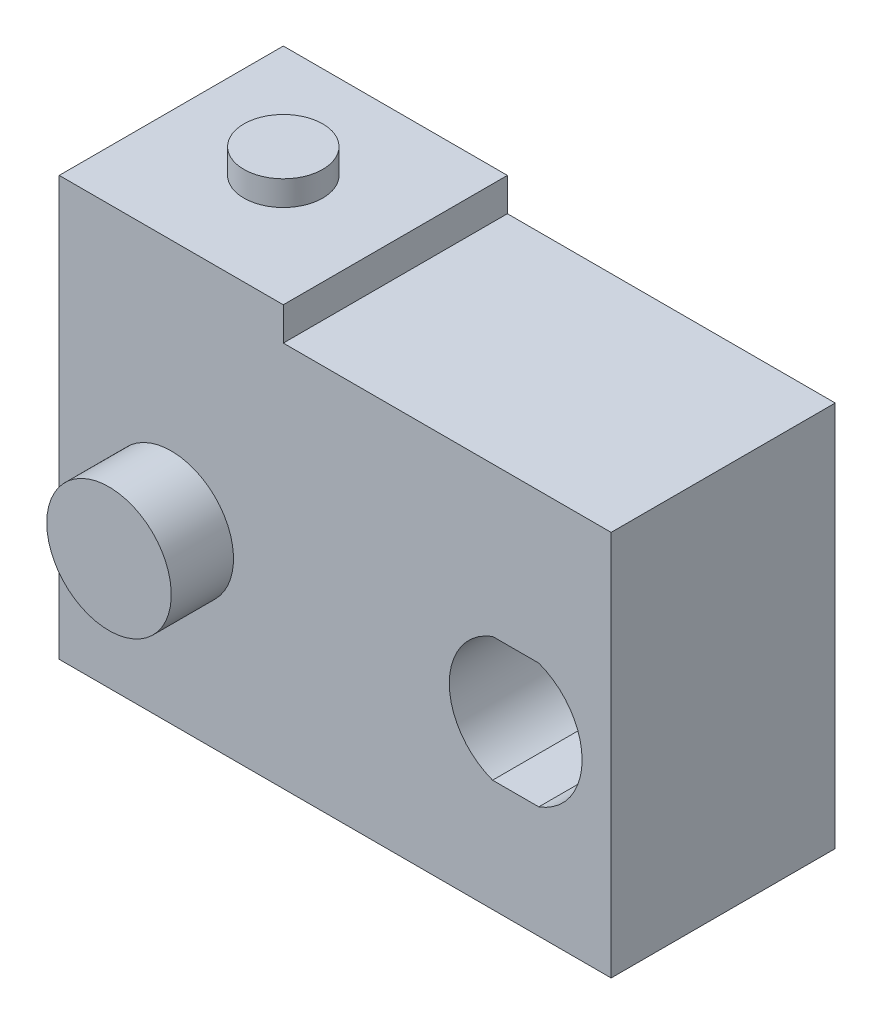
ISO-10303-21;
HEADER;
FILE_DESCRIPTION(('STEP AP214'),'2;1');
FILE_NAME('part.step','',(''),(''),'','','');
FILE_SCHEMA(('AUTOMOTIVE_DESIGN { 1 0 10303 214 1 1 1 1 }'));
ENDSEC;
DATA;
#1=APPLICATION_CONTEXT('core data for automotive mechanical design processes');
#2=APPLICATION_PROTOCOL_DEFINITION('international standard','automotive_design',2000,#1);
#3=PRODUCT_CONTEXT('',#1,'mechanical');
#4=PRODUCT('Part','Part','',(#3));
#5=PRODUCT_RELATED_PRODUCT_CATEGORY('part','',(#4));
#6=PRODUCT_DEFINITION_FORMATION('','',#4);
#7=PRODUCT_DEFINITION_CONTEXT('part definition',#1,'design');
#8=PRODUCT_DEFINITION('design','',#6,#7);
#9=PRODUCT_DEFINITION_SHAPE('','',#8);
#10=(LENGTH_UNIT() NAMED_UNIT(*) SI_UNIT(.MILLI.,.METRE.));
#11=(NAMED_UNIT(*) PLANE_ANGLE_UNIT() SI_UNIT($,.RADIAN.));
#12=(NAMED_UNIT(*) SI_UNIT($,.STERADIAN.) SOLID_ANGLE_UNIT());
#13=UNCERTAINTY_MEASURE_WITH_UNIT(LENGTH_MEASURE(1.E-05),#10,'distance_accuracy_value','');
#14=(GEOMETRIC_REPRESENTATION_CONTEXT(3) GLOBAL_UNCERTAINTY_ASSIGNED_CONTEXT((#13)) GLOBAL_UNIT_ASSIGNED_CONTEXT((#10,
#11,#12)) REPRESENTATION_CONTEXT('',''));
#15=CARTESIAN_POINT('',(0.,0.,0.));
#16=DIRECTION('',(0.,0.,1.));
#17=DIRECTION('',(1.,0.,0.));
#18=AXIS2_PLACEMENT_3D('',#15,#16,#17);
#19=CARTESIAN_POINT('',(0.,0.,2.7));
#20=DIRECTION('',(0.,0.,-1.));
#21=DIRECTION('',(-1.,0.,0.));
#22=AXIS2_PLACEMENT_3D('',#19,#20,#21);
#23=PLANE('',#22);
#24=CARTESIAN_POINT('',(-3.95,-0.449999999999998,2.7));
#25=DIRECTION('',(0.,0.,-1.));
#26=DIRECTION('',(-1.,0.,0.));
#27=AXIS2_PLACEMENT_3D('',#24,#25,#26);
#28=CIRCLE('',#27,1.5);
#29=CARTESIAN_POINT('',(-5.45,-0.449999999999998,2.7));
#30=VERTEX_POINT('',#29);
#31=EDGE_CURVE('E49',#30,#30,#28,.F.);
#32=ORIENTED_EDGE('',*,*,#31,.F.);
#33=EDGE_LOOP('',(#32));
#34=FACE_BOUND('',#33,.T.);
#35=DIRECTION('',(0.,-1.,0.));
#36=VECTOR('',#35,1.);
#37=CARTESIAN_POINT('',(-6.65,4.65,2.7));
#38=LINE('',#37,#36);
#39=CARTESIAN_POINT('',(-6.65,5.45,2.7));
#40=VERTEX_POINT('',#39);
#41=CARTESIAN_POINT('',(-6.65,-4.65,2.7));
#42=VERTEX_POINT('',#41);
#43=EDGE_CURVE('E156',#40,#42,#38,.T.);
#44=ORIENTED_EDGE('',*,*,#43,.T.);
#45=DIRECTION('',(1.,0.,0.));
#46=VECTOR('',#45,1.);
#47=CARTESIAN_POINT('',(6.65,-4.65,2.7));
#48=LINE('',#47,#46);
#49=CARTESIAN_POINT('',(6.65,-4.65,2.7));
#50=VERTEX_POINT('',#49);
#51=EDGE_CURVE('E158',#42,#50,#48,.T.);
#52=ORIENTED_EDGE('',*,*,#51,.T.);
#53=DIRECTION('',(0.,1.,0.));
#54=VECTOR('',#53,1.);
#55=CARTESIAN_POINT('',(6.65,-4.65,2.7));
#56=LINE('',#55,#54);
#57=CARTESIAN_POINT('',(6.65,4.65,2.7));
#58=VERTEX_POINT('',#57);
#59=EDGE_CURVE('E161',#50,#58,#56,.T.);
#60=ORIENTED_EDGE('',*,*,#59,.T.);
#61=DIRECTION('',(-1.,0.,0.));
#62=VECTOR('',#61,1.);
#63=CARTESIAN_POINT('',(6.65,4.65,2.7));
#64=LINE('',#63,#62);
#65=CARTESIAN_POINT('',(-1.25,4.65,2.7));
#66=VERTEX_POINT('',#65);
#67=EDGE_CURVE('E163',#58,#66,#64,.T.);
#68=ORIENTED_EDGE('',*,*,#67,.T.);
#69=DIRECTION('',(0.,1.,0.));
#70=VECTOR('',#69,1.);
#71=CARTESIAN_POINT('',(-1.25,5.45,2.7));
#72=LINE('',#71,#70);
#73=CARTESIAN_POINT('',(-1.25,5.45,2.7));
#74=VERTEX_POINT('',#73);
#75=EDGE_CURVE('E165',#66,#74,#72,.T.);
#76=ORIENTED_EDGE('',*,*,#75,.T.);
#77=DIRECTION('',(-1.,0.,0.));
#78=VECTOR('',#77,1.);
#79=CARTESIAN_POINT('',(-6.65,5.45,2.7));
#80=LINE('',#79,#78);
#81=EDGE_CURVE('E167',#74,#40,#80,.T.);
#82=ORIENTED_EDGE('',*,*,#81,.T.);
#83=EDGE_LOOP('',(#44,#52,#60,#68,#76,#82));
#84=FACE_BOUND('',#83,.T.);
#85=CARTESIAN_POINT('',(4.35,-0.449999999999998,2.7));
#86=DIRECTION('',(0.,0.,1.));
#87=DIRECTION('',(1.,0.,0.));
#88=AXIS2_PLACEMENT_3D('',#85,#86,#87);
#89=CIRCLE('',#88,1.6);
#90=CARTESIAN_POINT('',(3.79322356371699,1.05,2.7));
#91=VERTEX_POINT('',#90);
#92=CARTESIAN_POINT('',(3.79322356371699,-1.95,2.7));
#93=VERTEX_POINT('',#92);
#94=EDGE_CURVE('E119',#91,#93,#89,.T.);
#95=ORIENTED_EDGE('',*,*,#94,.F.);
#96=DIRECTION('',(-1.,0.,0.));
#97=VECTOR('',#96,1.);
#98=CARTESIAN_POINT('',(3.79322356371699,1.05,2.7));
#99=LINE('',#98,#97);
#100=CARTESIAN_POINT('',(4.906776436283,1.05,2.7));
#101=VERTEX_POINT('',#100);
#102=EDGE_CURVE('E141',#101,#91,#99,.T.);
#103=ORIENTED_EDGE('',*,*,#102,.F.);
#104=CARTESIAN_POINT('',(4.35,-0.449999999999998,2.7));
#105=DIRECTION('',(0.,0.,1.));
#106=DIRECTION('',(1.,0.,0.));
#107=AXIS2_PLACEMENT_3D('',#104,#105,#106);
#108=CIRCLE('',#107,1.6);
#109=CARTESIAN_POINT('',(4.906776436283,-1.95,2.7));
#110=VERTEX_POINT('',#109);
#111=EDGE_CURVE('E139',#110,#101,#108,.T.);
#112=ORIENTED_EDGE('',*,*,#111,.F.);
#113=DIRECTION('',(1.,0.,0.));
#114=VECTOR('',#113,1.);
#115=CARTESIAN_POINT('',(4.906776436283,-1.95,2.7));
#116=LINE('',#115,#114);
#117=EDGE_CURVE('E127',#93,#110,#116,.T.);
#118=ORIENTED_EDGE('',*,*,#117,.F.);
#119=EDGE_LOOP('',(#95,#103,#112,#118));
#120=FACE_BOUND('',#119,.T.);
#121=ADVANCED_FACE('F40',(#34,#84,#120),#23,.F.);
#122=CARTESIAN_POINT('',(0.,0.,-2.7));
#123=DIRECTION('',(0.,0.,-1.));
#124=DIRECTION('',(-1.,0.,0.));
#125=AXIS2_PLACEMENT_3D('',#122,#123,#124);
#126=PLANE('',#125);
#127=CARTESIAN_POINT('',(-3.95,-0.449999999999998,-2.7));
#128=DIRECTION('',(0.,0.,-1.));
#129=DIRECTION('',(-1.,0.,0.));
#130=AXIS2_PLACEMENT_3D('',#127,#128,#129);
#131=CIRCLE('',#130,1.5);
#132=CARTESIAN_POINT('',(-5.45,-0.449999999999998,-2.7));
#133=VERTEX_POINT('',#132);
#134=EDGE_CURVE('E44',#133,#133,#131,.F.);
#135=ORIENTED_EDGE('',*,*,#134,.T.);
#136=EDGE_LOOP('',(#135));
#137=FACE_BOUND('',#136,.T.);
#138=DIRECTION('',(0.,-1.,0.));
#139=VECTOR('',#138,1.);
#140=CARTESIAN_POINT('',(-6.65,-4.65,-2.7));
#141=LINE('',#140,#139);
#142=CARTESIAN_POINT('',(-6.65,5.45,-2.7));
#143=VERTEX_POINT('',#142);
#144=CARTESIAN_POINT('',(-6.65,-4.65,-2.7));
#145=VERTEX_POINT('',#144);
#146=EDGE_CURVE('E135',#143,#145,#141,.T.);
#147=ORIENTED_EDGE('',*,*,#146,.F.);
#148=DIRECTION('',(-1.,0.,0.));
#149=VECTOR('',#148,1.);
#150=CARTESIAN_POINT('',(-6.65,5.45,-2.7));
#151=LINE('',#150,#149);
#152=CARTESIAN_POINT('',(-1.25,5.45,-2.7));
#153=VERTEX_POINT('',#152);
#154=EDGE_CURVE('E159',#153,#143,#151,.T.);
#155=ORIENTED_EDGE('',*,*,#154,.F.);
#156=DIRECTION('',(0.,1.,0.));
#157=VECTOR('',#156,1.);
#158=CARTESIAN_POINT('',(-1.25,5.45,-2.7));
#159=LINE('',#158,#157);
#160=CARTESIAN_POINT('',(-1.25,4.65,-2.7));
#161=VERTEX_POINT('',#160);
#162=EDGE_CURVE('E177',#161,#153,#159,.T.);
#163=ORIENTED_EDGE('',*,*,#162,.F.);
#164=DIRECTION('',(-1.,0.,0.));
#165=VECTOR('',#164,1.);
#166=CARTESIAN_POINT('',(6.65,4.65,-2.7));
#167=LINE('',#166,#165);
#168=CARTESIAN_POINT('',(6.65,4.65,-2.7));
#169=VERTEX_POINT('',#168);
#170=EDGE_CURVE('E175',#169,#161,#167,.T.);
#171=ORIENTED_EDGE('',*,*,#170,.F.);
#172=DIRECTION('',(0.,1.,0.));
#173=VECTOR('',#172,1.);
#174=CARTESIAN_POINT('',(6.65,-4.65,-2.7));
#175=LINE('',#174,#173);
#176=CARTESIAN_POINT('',(6.65,-4.65,-2.7));
#177=VERTEX_POINT('',#176);
#178=EDGE_CURVE('E173',#177,#169,#175,.T.);
#179=ORIENTED_EDGE('',*,*,#178,.F.);
#180=DIRECTION('',(1.,0.,0.));
#181=VECTOR('',#180,1.);
#182=CARTESIAN_POINT('',(6.65,-4.65,-2.7));
#183=LINE('',#182,#181);
#184=EDGE_CURVE('E171',#145,#177,#183,.T.);
#185=ORIENTED_EDGE('',*,*,#184,.F.);
#186=EDGE_LOOP('',(#147,#155,#163,#171,#179,#185));
#187=FACE_BOUND('',#186,.T.);
#188=DIRECTION('',(-1.,0.,0.));
#189=VECTOR('',#188,1.);
#190=CARTESIAN_POINT('',(3.79322356371699,1.05,-2.7));
#191=LINE('',#190,#189);
#192=CARTESIAN_POINT('',(4.906776436283,1.05,-2.7));
#193=VERTEX_POINT('',#192);
#194=CARTESIAN_POINT('',(3.79322356371699,1.05,-2.7));
#195=VERTEX_POINT('',#194);
#196=EDGE_CURVE('E128',#193,#195,#191,.T.);
#197=ORIENTED_EDGE('',*,*,#196,.T.);
#198=CARTESIAN_POINT('',(4.35,-0.449999999999998,-2.7));
#199=DIRECTION('',(0.,0.,1.));
#200=DIRECTION('',(1.,0.,0.));
#201=AXIS2_PLACEMENT_3D('',#198,#199,#200);
#202=CIRCLE('',#201,1.6);
#203=CARTESIAN_POINT('',(3.79322356371699,-1.95,-2.7));
#204=VERTEX_POINT('',#203);
#205=EDGE_CURVE('E65',#195,#204,#202,.T.);
#206=ORIENTED_EDGE('',*,*,#205,.T.);
#207=DIRECTION('',(1.,0.,0.));
#208=VECTOR('',#207,1.);
#209=CARTESIAN_POINT('',(4.906776436283,-1.95,-2.7));
#210=LINE('',#209,#208);
#211=CARTESIAN_POINT('',(4.906776436283,-1.95,-2.7));
#212=VERTEX_POINT('',#211);
#213=EDGE_CURVE('E134',#204,#212,#210,.T.);
#214=ORIENTED_EDGE('',*,*,#213,.T.);
#215=CARTESIAN_POINT('',(4.35,-0.449999999999998,-2.7));
#216=DIRECTION('',(0.,0.,1.));
#217=DIRECTION('',(1.,0.,0.));
#218=AXIS2_PLACEMENT_3D('',#215,#216,#217);
#219=CIRCLE('',#218,1.6);
#220=EDGE_CURVE('E148',#212,#193,#219,.T.);
#221=ORIENTED_EDGE('',*,*,#220,.T.);
#222=EDGE_LOOP('',(#197,#206,#214,#221));
#223=FACE_BOUND('',#222,.T.);
#224=ADVANCED_FACE('F230',(#137,#187,#223),#126,.T.);
#225=CARTESIAN_POINT('',(-6.65,-4.65,2.7));
#226=DIRECTION('',(1.,0.,0.));
#227=DIRECTION('',(0.,0.,-1.));
#228=AXIS2_PLACEMENT_3D('',#225,#226,#227);
#229=PLANE('',#228);
#230=ORIENTED_EDGE('',*,*,#146,.T.);
#231=DIRECTION('',(0.,0.,-1.));
#232=VECTOR('',#231,1.);
#233=CARTESIAN_POINT('',(-6.65,-4.65,2.7));
#234=LINE('',#233,#232);
#235=EDGE_CURVE('E194',#42,#145,#234,.T.);
#236=ORIENTED_EDGE('',*,*,#235,.F.);
#237=ORIENTED_EDGE('',*,*,#43,.F.);
#238=DIRECTION('',(0.,0.,-1.));
#239=VECTOR('',#238,1.);
#240=CARTESIAN_POINT('',(-6.65,5.45,2.7));
#241=LINE('',#240,#239);
#242=EDGE_CURVE('E169',#40,#143,#241,.T.);
#243=ORIENTED_EDGE('',*,*,#242,.T.);
#244=EDGE_LOOP('',(#230,#236,#237,#243));
#245=FACE_BOUND('',#244,.T.);
#246=ADVANCED_FACE('F42',(#245),#229,.F.);
#247=CARTESIAN_POINT('',(6.65,-4.65,2.7));
#248=DIRECTION('',(0.,1.,0.));
#249=DIRECTION('',(-1.,0.,0.));
#250=AXIS2_PLACEMENT_3D('',#247,#248,#249);
#251=PLANE('',#250);
#252=ORIENTED_EDGE('',*,*,#184,.T.);
#253=DIRECTION('',(0.,0.,-1.));
#254=VECTOR('',#253,1.);
#255=CARTESIAN_POINT('',(6.65,-4.65,2.7));
#256=LINE('',#255,#254);
#257=EDGE_CURVE('E192',#50,#177,#256,.T.);
#258=ORIENTED_EDGE('',*,*,#257,.F.);
#259=ORIENTED_EDGE('',*,*,#51,.F.);
#260=ORIENTED_EDGE('',*,*,#235,.T.);
#261=EDGE_LOOP('',(#252,#258,#259,#260));
#262=FACE_BOUND('',#261,.T.);
#263=ADVANCED_FACE('F256',(#262),#251,.F.);
#264=CARTESIAN_POINT('',(6.65,-4.65,2.7));
#265=DIRECTION('',(-1.,0.,0.));
#266=DIRECTION('',(0.,0.,1.));
#267=AXIS2_PLACEMENT_3D('',#264,#265,#266);
#268=PLANE('',#267);
#269=ORIENTED_EDGE('',*,*,#178,.T.);
#270=DIRECTION('',(0.,0.,-1.));
#271=VECTOR('',#270,1.);
#272=CARTESIAN_POINT('',(6.65,4.65,2.7));
#273=LINE('',#272,#271);
#274=EDGE_CURVE('E189',#58,#169,#273,.T.);
#275=ORIENTED_EDGE('',*,*,#274,.F.);
#276=ORIENTED_EDGE('',*,*,#59,.F.);
#277=ORIENTED_EDGE('',*,*,#257,.T.);
#278=EDGE_LOOP('',(#269,#275,#276,#277));
#279=FACE_BOUND('',#278,.T.);
#280=ADVANCED_FACE('F253',(#279),#268,.F.);
#281=CARTESIAN_POINT('',(6.65,4.65,2.7));
#282=DIRECTION('',(0.,-1.,0.));
#283=DIRECTION('',(1.,0.,0.));
#284=AXIS2_PLACEMENT_3D('',#281,#282,#283);
#285=PLANE('',#284);
#286=ORIENTED_EDGE('',*,*,#170,.T.);
#287=DIRECTION('',(0.,0.,-1.));
#288=VECTOR('',#287,1.);
#289=CARTESIAN_POINT('',(-1.25,4.65,2.7));
#290=LINE('',#289,#288);
#291=EDGE_CURVE('E186',#66,#161,#290,.T.);
#292=ORIENTED_EDGE('',*,*,#291,.F.);
#293=ORIENTED_EDGE('',*,*,#67,.F.);
#294=ORIENTED_EDGE('',*,*,#274,.T.);
#295=EDGE_LOOP('',(#286,#292,#293,#294));
#296=FACE_BOUND('',#295,.T.);
#297=ADVANCED_FACE('F249',(#296),#285,.F.);
#298=CARTESIAN_POINT('',(-1.25,5.45,2.7));
#299=DIRECTION('',(-1.,0.,0.));
#300=DIRECTION('',(0.,0.,1.));
#301=AXIS2_PLACEMENT_3D('',#298,#299,#300);
#302=PLANE('',#301);
#303=ORIENTED_EDGE('',*,*,#162,.T.);
#304=DIRECTION('',(0.,0.,-1.));
#305=VECTOR('',#304,1.);
#306=CARTESIAN_POINT('',(-1.25,5.45,2.7));
#307=LINE('',#306,#305);
#308=EDGE_CURVE('E183',#74,#153,#307,.T.);
#309=ORIENTED_EDGE('',*,*,#308,.F.);
#310=ORIENTED_EDGE('',*,*,#75,.F.);
#311=ORIENTED_EDGE('',*,*,#291,.T.);
#312=EDGE_LOOP('',(#303,#309,#310,#311));
#313=FACE_BOUND('',#312,.T.);
#314=ADVANCED_FACE('F245',(#313),#302,.F.);
#315=CARTESIAN_POINT('',(-6.65,5.45,2.7));
#316=DIRECTION('',(0.,-1.,0.));
#317=DIRECTION('',(0.,0.,-1.));
#318=AXIS2_PLACEMENT_3D('',#315,#316,#317);
#319=PLANE('',#318);
#320=CARTESIAN_POINT('',(-3.95,5.45,0.));
#321=DIRECTION('',(0.,1.,0.));
#322=DIRECTION('',(0.,0.,1.));
#323=AXIS2_PLACEMENT_3D('',#320,#321,#322);
#324=CIRCLE('',#323,0.95);
#325=CARTESIAN_POINT('',(-3.95,5.45,0.95));
#326=VERTEX_POINT('',#325);
#327=EDGE_CURVE('E12',#326,#326,#324,.T.);
#328=ORIENTED_EDGE('',*,*,#327,.F.);
#329=EDGE_LOOP('',(#328));
#330=FACE_BOUND('',#329,.T.);
#331=ORIENTED_EDGE('',*,*,#154,.T.);
#332=ORIENTED_EDGE('',*,*,#242,.F.);
#333=ORIENTED_EDGE('',*,*,#81,.F.);
#334=ORIENTED_EDGE('',*,*,#308,.T.);
#335=EDGE_LOOP('',(#331,#332,#333,#334));
#336=FACE_BOUND('',#335,.T.);
#337=ADVANCED_FACE('F242',(#330,#336),#319,.F.);
#338=CARTESIAN_POINT('',(4.35,-0.449999999999998,2.7));
#339=DIRECTION('',(0.,0.,-1.));
#340=DIRECTION('',(-1.,0.,0.));
#341=AXIS2_PLACEMENT_3D('',#338,#339,#340);
#342=CYLINDRICAL_SURFACE('',#341,1.6);
#343=ORIENTED_EDGE('',*,*,#205,.F.);
#344=DIRECTION('',(0.,0.,-1.));
#345=VECTOR('',#344,1.);
#346=CARTESIAN_POINT('',(3.79322356371699,1.05,2.7));
#347=LINE('',#346,#345);
#348=EDGE_CURVE('E123',#91,#195,#347,.T.);
#349=ORIENTED_EDGE('',*,*,#348,.F.);
#350=ORIENTED_EDGE('',*,*,#94,.T.);
#351=DIRECTION('',(0.,0.,-1.));
#352=VECTOR('',#351,1.);
#353=CARTESIAN_POINT('',(3.79322356371699,-1.95,2.7));
#354=LINE('',#353,#352);
#355=EDGE_CURVE('E122',#93,#204,#354,.T.);
#356=ORIENTED_EDGE('',*,*,#355,.T.);
#357=EDGE_LOOP('',(#343,#349,#350,#356));
#358=FACE_BOUND('',#357,.T.);
#359=ADVANCED_FACE('F121',(#358),#342,.F.);
#360=CARTESIAN_POINT('',(4.906776436283,-1.95,2.7));
#361=DIRECTION('',(0.,1.,0.));
#362=DIRECTION('',(-1.,0.,0.));
#363=AXIS2_PLACEMENT_3D('',#360,#361,#362);
#364=PLANE('',#363);
#365=ORIENTED_EDGE('',*,*,#213,.F.);
#366=ORIENTED_EDGE('',*,*,#355,.F.);
#367=ORIENTED_EDGE('',*,*,#117,.T.);
#368=DIRECTION('',(0.,0.,-1.));
#369=VECTOR('',#368,1.);
#370=CARTESIAN_POINT('',(4.906776436283,-1.95,2.7));
#371=LINE('',#370,#369);
#372=EDGE_CURVE('E136',#110,#212,#371,.T.);
#373=ORIENTED_EDGE('',*,*,#372,.T.);
#374=EDGE_LOOP('',(#365,#366,#367,#373));
#375=FACE_BOUND('',#374,.T.);
#376=ADVANCED_FACE('F131',(#375),#364,.T.);
#377=CARTESIAN_POINT('',(4.35,-0.449999999999998,2.7));
#378=DIRECTION('',(0.,0.,-1.));
#379=DIRECTION('',(-1.,0.,0.));
#380=AXIS2_PLACEMENT_3D('',#377,#378,#379);
#381=CYLINDRICAL_SURFACE('',#380,1.6);
#382=ORIENTED_EDGE('',*,*,#220,.F.);
#383=ORIENTED_EDGE('',*,*,#372,.F.);
#384=ORIENTED_EDGE('',*,*,#111,.T.);
#385=DIRECTION('',(0.,0.,-1.));
#386=VECTOR('',#385,1.);
#387=CARTESIAN_POINT('',(4.906776436283,1.05,2.7));
#388=LINE('',#387,#386);
#389=EDGE_CURVE('E57',#101,#193,#388,.T.);
#390=ORIENTED_EDGE('',*,*,#389,.T.);
#391=EDGE_LOOP('',(#382,#383,#384,#390));
#392=FACE_BOUND('',#391,.T.);
#393=ADVANCED_FACE('F284',(#392),#381,.F.);
#394=CARTESIAN_POINT('',(3.79322356371699,1.05,2.7));
#395=DIRECTION('',(0.,-1.,0.));
#396=DIRECTION('',(1.,0.,0.));
#397=AXIS2_PLACEMENT_3D('',#394,#395,#396);
#398=PLANE('',#397);
#399=ORIENTED_EDGE('',*,*,#196,.F.);
#400=ORIENTED_EDGE('',*,*,#389,.F.);
#401=ORIENTED_EDGE('',*,*,#102,.T.);
#402=ORIENTED_EDGE('',*,*,#348,.T.);
#403=EDGE_LOOP('',(#399,#400,#401,#402));
#404=FACE_BOUND('',#403,.T.);
#405=ADVANCED_FACE('F281',(#404),#398,.T.);
#406=CARTESIAN_POINT('',(0.,0.,-4.2));
#407=DIRECTION('',(0.,0.,-1.));
#408=DIRECTION('',(-1.,0.,0.));
#409=AXIS2_PLACEMENT_3D('',#406,#407,#408);
#410=PLANE('',#409);
#411=CARTESIAN_POINT('',(-3.95,-0.449999999999998,-4.2));
#412=DIRECTION('',(0.,0.,-1.));
#413=DIRECTION('',(-1.,0.,0.));
#414=AXIS2_PLACEMENT_3D('',#411,#412,#413);
#415=CIRCLE('',#414,1.5);
#416=CARTESIAN_POINT('',(-5.45,-0.449999999999998,-4.2));
#417=VERTEX_POINT('',#416);
#418=EDGE_CURVE('E207',#417,#417,#415,.F.);
#419=ORIENTED_EDGE('',*,*,#418,.F.);
#420=EDGE_LOOP('',(#419));
#421=FACE_BOUND('',#420,.T.);
#422=ADVANCED_FACE('F283',(#421),#410,.T.);
#423=CARTESIAN_POINT('',(-3.95,-0.449999999999998,9.94264068711929));
#424=DIRECTION('',(0.,0.,-1.));
#425=DIRECTION('',(-1.,0.,0.));
#426=AXIS2_PLACEMENT_3D('',#423,#424,#425);
#427=CYLINDRICAL_SURFACE('',#426,1.5);
#428=ORIENTED_EDGE('',*,*,#134,.F.);
#429=EDGE_LOOP('',(#428));
#430=FACE_BOUND('',#429,.T.);
#431=ORIENTED_EDGE('',*,*,#418,.T.);
#432=EDGE_LOOP('',(#431));
#433=FACE_BOUND('',#432,.T.);
#434=ADVANCED_FACE('F290',(#430,#433),#427,.T.);
#435=CARTESIAN_POINT('',(-3.95,-0.449999999999998,4.2));
#436=DIRECTION('',(0.,0.,-1.));
#437=DIRECTION('',(-1.,0.,0.));
#438=AXIS2_PLACEMENT_3D('',#435,#436,#437);
#439=CIRCLE('',#438,1.5);
#440=CARTESIAN_POINT('',(-5.45,-0.449999999999998,4.2));
#441=VERTEX_POINT('',#440);
#442=EDGE_CURVE('E204',#441,#441,#439,.T.);
#443=ORIENTED_EDGE('',*,*,#442,.T.);
#444=EDGE_LOOP('',(#443));
#445=FACE_BOUND('',#444,.T.);
#446=ORIENTED_EDGE('',*,*,#31,.T.);
#447=EDGE_LOOP('',(#446));
#448=FACE_BOUND('',#447,.T.);
#449=ADVANCED_FACE('F226',(#445,#448),#427,.T.);
#450=CARTESIAN_POINT('',(0.,0.,4.2));
#451=DIRECTION('',(0.,0.,-1.));
#452=DIRECTION('',(-1.,0.,0.));
#453=AXIS2_PLACEMENT_3D('',#450,#451,#452);
#454=PLANE('',#453);
#455=ORIENTED_EDGE('',*,*,#442,.F.);
#456=EDGE_LOOP('',(#455));
#457=FACE_BOUND('',#456,.T.);
#458=ADVANCED_FACE('F218',(#457),#454,.F.);
#459=CARTESIAN_POINT('',(-3.95,19.4370057685089,0.));
#460=DIRECTION('',(0.,-1.,0.));
#461=DIRECTION('',(0.,0.,-1.));
#462=AXIS2_PLACEMENT_3D('',#459,#460,#461);
#463=CYLINDRICAL_SURFACE('',#462,0.95);
#464=ORIENTED_EDGE('',*,*,#327,.T.);
#465=EDGE_LOOP('',(#464));
#466=FACE_BOUND('',#465,.T.);
#467=CARTESIAN_POINT('',(-3.95,6.05,0.));
#468=DIRECTION('',(0.,1.,0.));
#469=DIRECTION('',(-1.,0.,0.));
#470=AXIS2_PLACEMENT_3D('',#467,#468,#469);
#471=CIRCLE('',#470,0.95);
#472=CARTESIAN_POINT('',(-4.9,6.05,0.));
#473=VERTEX_POINT('',#472);
#474=EDGE_CURVE('E210',#473,#473,#471,.T.);
#475=ORIENTED_EDGE('',*,*,#474,.F.);
#476=EDGE_LOOP('',(#475));
#477=FACE_BOUND('',#476,.T.);
#478=ADVANCED_FACE('F216',(#466,#477),#463,.T.);
#479=CARTESIAN_POINT('',(6.65,6.05,2.7));
#480=DIRECTION('',(0.,1.,0.));
#481=DIRECTION('',(-1.,0.,0.));
#482=AXIS2_PLACEMENT_3D('',#479,#480,#481);
#483=PLANE('',#482);
#484=ORIENTED_EDGE('',*,*,#474,.T.);
#485=EDGE_LOOP('',(#484));
#486=FACE_BOUND('',#485,.T.);
#487=ADVANCED_FACE('F214',(#486),#483,.T.);
#488=CLOSED_SHELL('',(#121,#224,#246,#263,#280,#297,#314,#337,#359,#376,#393,#405,#422,#434,
#449,#458,#478,#487));
#489=MANIFOLD_SOLID_BREP('B2',#488);
#490=ADVANCED_BREP_SHAPE_REPRESENTATION('',(#18,#489),#14);
#491=SHAPE_DEFINITION_REPRESENTATION(#9,#490);
ENDSEC;
END-ISO-10303-21;
